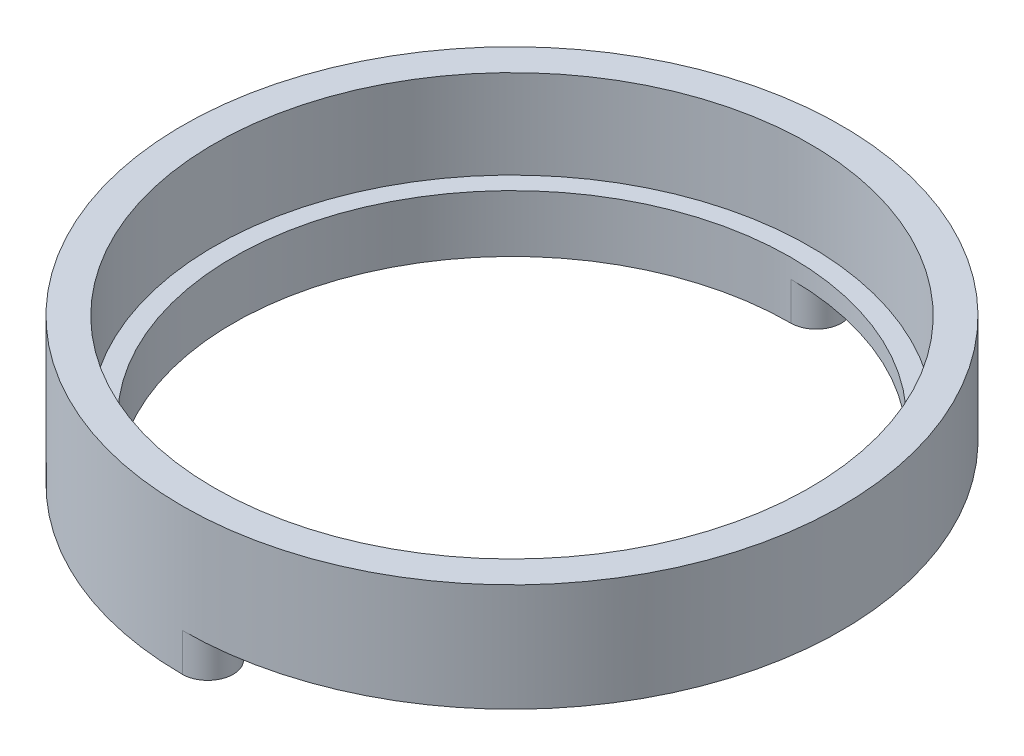
ISO-10303-21;
HEADER;
FILE_DESCRIPTION(('STEP AP214'),'2;1');
FILE_NAME('part.step','',(''),(''),'','','');
FILE_SCHEMA(('AUTOMOTIVE_DESIGN { 1 0 10303 214 1 1 1 1 }'));
ENDSEC;
DATA;
#1=APPLICATION_CONTEXT('core data for automotive mechanical design processes');
#2=APPLICATION_PROTOCOL_DEFINITION('international standard','automotive_design',2000,#1);
#3=PRODUCT_CONTEXT('',#1,'mechanical');
#4=PRODUCT('Part','Part','',(#3));
#5=PRODUCT_RELATED_PRODUCT_CATEGORY('part','',(#4));
#6=PRODUCT_DEFINITION_FORMATION('','',#4);
#7=PRODUCT_DEFINITION_CONTEXT('part definition',#1,'design');
#8=PRODUCT_DEFINITION('design','',#6,#7);
#9=PRODUCT_DEFINITION_SHAPE('','',#8);
#10=(LENGTH_UNIT() NAMED_UNIT(*) SI_UNIT(.MILLI.,.METRE.));
#11=(NAMED_UNIT(*) PLANE_ANGLE_UNIT() SI_UNIT($,.RADIAN.));
#12=(NAMED_UNIT(*) SI_UNIT($,.STERADIAN.) SOLID_ANGLE_UNIT());
#13=UNCERTAINTY_MEASURE_WITH_UNIT(LENGTH_MEASURE(1.E-05),#10,'distance_accuracy_value','');
#14=(GEOMETRIC_REPRESENTATION_CONTEXT(3) GLOBAL_UNCERTAINTY_ASSIGNED_CONTEXT((#13)) GLOBAL_UNIT_ASSIGNED_CONTEXT((#10,
#11,#12)) REPRESENTATION_CONTEXT('',''));
#15=CARTESIAN_POINT('',(0.,0.,0.));
#16=DIRECTION('',(0.,0.,1.));
#17=DIRECTION('',(1.,0.,0.));
#18=AXIS2_PLACEMENT_3D('',#15,#16,#17);
#19=CARTESIAN_POINT('',(0.,1.5,0.));
#20=DIRECTION('',(0.,1.,0.));
#21=DIRECTION('',(0.,0.,1.));
#22=AXIS2_PLACEMENT_3D('',#19,#20,#21);
#23=PLANE('',#22);
#24=CARTESIAN_POINT('',(0.,1.5,0.));
#25=DIRECTION('',(0.,1.,0.));
#26=DIRECTION('',(0.,0.,1.));
#27=AXIS2_PLACEMENT_3D('',#24,#25,#26);
#28=CIRCLE('',#27,23.5);
#29=CARTESIAN_POINT('',(0.,1.5,23.5));
#30=VERTEX_POINT('',#29);
#31=EDGE_CURVE('E104',#30,#30,#28,.F.);
#32=ORIENTED_EDGE('',*,*,#31,.F.);
#33=EDGE_LOOP('',(#32));
#34=FACE_BOUND('',#33,.T.);
#35=CARTESIAN_POINT('',(0.,1.5,0.));
#36=DIRECTION('',(0.,1.,0.));
#37=DIRECTION('',(0.,0.,1.));
#38=AXIS2_PLACEMENT_3D('',#35,#36,#37);
#39=CIRCLE('',#38,22.);
#40=CARTESIAN_POINT('',(0.,1.5,22.));
#41=VERTEX_POINT('',#40);
#42=EDGE_CURVE('E11',#41,#41,#39,.T.);
#43=ORIENTED_EDGE('',*,*,#42,.F.);
#44=EDGE_LOOP('',(#43));
#45=FACE_BOUND('',#44,.T.);
#46=ADVANCED_FACE('F32',(#34,#45),#23,.T.);
#47=CARTESIAN_POINT('',(0.,0.,0.));
#48=DIRECTION('',(0.,1.,0.));
#49=DIRECTION('',(0.,0.,1.));
#50=AXIS2_PLACEMENT_3D('',#47,#48,#49);
#51=PLANE('',#50);
#52=CARTESIAN_POINT('',(0.,0.,24.));
#53=DIRECTION('',(0.,-1.,0.));
#54=DIRECTION('',(0.,0.,-1.));
#55=AXIS2_PLACEMENT_3D('',#52,#53,#54);
#56=CIRCLE('',#55,2.);
#57=CARTESIAN_POINT('',(0.,0.,22.));
#58=VERTEX_POINT('',#57);
#59=CARTESIAN_POINT('',(0.,0.,26.));
#60=VERTEX_POINT('',#59);
#61=EDGE_CURVE('E92',#58,#60,#56,.T.);
#62=ORIENTED_EDGE('',*,*,#61,.F.);
#63=CARTESIAN_POINT('',(0.,0.,0.));
#64=DIRECTION('',(0.,1.,0.));
#65=DIRECTION('',(0.,0.,1.));
#66=AXIS2_PLACEMENT_3D('',#63,#64,#65);
#67=CIRCLE('',#66,22.);
#68=CARTESIAN_POINT('',(0.,0.,-22.));
#69=VERTEX_POINT('',#68);
#70=EDGE_CURVE('E36',#58,#69,#67,.T.);
#71=ORIENTED_EDGE('',*,*,#70,.T.);
#72=CARTESIAN_POINT('',(0.,0.,-24.));
#73=DIRECTION('',(0.,-1.,0.));
#74=DIRECTION('',(0.,0.,-1.));
#75=AXIS2_PLACEMENT_3D('',#72,#73,#74);
#76=CIRCLE('',#75,2.);
#77=CARTESIAN_POINT('',(0.,0.,-26.));
#78=VERTEX_POINT('',#77);
#79=EDGE_CURVE('E47',#78,#69,#76,.T.);
#80=ORIENTED_EDGE('',*,*,#79,.F.);
#81=CARTESIAN_POINT('',(0.,0.,0.));
#82=DIRECTION('',(0.,1.,0.));
#83=DIRECTION('',(0.,0.,1.));
#84=AXIS2_PLACEMENT_3D('',#81,#82,#83);
#85=CIRCLE('',#84,26.);
#86=EDGE_CURVE('E51',#60,#78,#85,.T.);
#87=ORIENTED_EDGE('',*,*,#86,.F.);
#88=EDGE_LOOP('',(#62,#71,#80,#87));
#89=FACE_BOUND('',#88,.T.);
#90=ADVANCED_FACE('F34',(#89),#51,.F.);
#91=CARTESIAN_POINT('',(0.,1.5,0.));
#92=DIRECTION('',(0.,-1.,0.));
#93=DIRECTION('',(0.,0.,-1.));
#94=AXIS2_PLACEMENT_3D('',#91,#92,#93);
#95=CYLINDRICAL_SURFACE('',#94,22.);
#96=ORIENTED_EDGE('',*,*,#42,.T.);
#97=EDGE_LOOP('',(#96));
#98=FACE_BOUND('',#97,.T.);
#99=ORIENTED_EDGE('',*,*,#70,.F.);
#100=DIRECTION('',(0.,1.,0.));
#101=VECTOR('',#100,1.);
#102=CARTESIAN_POINT('',(0.,-3.,22.));
#103=LINE('',#102,#101);
#104=CARTESIAN_POINT('',(0.,-3.,22.));
#105=VERTEX_POINT('',#104);
#106=EDGE_CURVE('E117',#105,#58,#103,.T.);
#107=ORIENTED_EDGE('',*,*,#106,.F.);
#108=CARTESIAN_POINT('',(0.,-3.,0.));
#109=DIRECTION('',(0.,1.,0.));
#110=DIRECTION('',(0.,0.,-1.));
#111=AXIS2_PLACEMENT_3D('',#108,#109,#110);
#112=CIRCLE('',#111,22.);
#113=CARTESIAN_POINT('',(0.,-3.,-22.));
#114=VERTEX_POINT('',#113);
#115=EDGE_CURVE('E86',#114,#105,#112,.T.);
#116=ORIENTED_EDGE('',*,*,#115,.F.);
#117=DIRECTION('',(0.,1.,0.));
#118=VECTOR('',#117,1.);
#119=CARTESIAN_POINT('',(0.,-3.,-22.));
#120=LINE('',#119,#118);
#121=EDGE_CURVE('E97',#114,#69,#120,.T.);
#122=ORIENTED_EDGE('',*,*,#121,.T.);
#123=EDGE_LOOP('',(#99,#107,#116,#122));
#124=FACE_BOUND('',#123,.T.);
#125=ADVANCED_FACE('F116',(#98,#124),#95,.F.);
#126=CARTESIAN_POINT('',(0.,8.5,0.));
#127=DIRECTION('',(0.,1.,0.));
#128=DIRECTION('',(0.,0.,1.));
#129=AXIS2_PLACEMENT_3D('',#126,#127,#128);
#130=PLANE('',#129);
#131=CARTESIAN_POINT('',(0.,8.5,0.));
#132=DIRECTION('',(0.,1.,0.));
#133=DIRECTION('',(0.,0.,1.));
#134=AXIS2_PLACEMENT_3D('',#131,#132,#133);
#135=CIRCLE('',#134,26.);
#136=CARTESIAN_POINT('',(0.,8.5,26.));
#137=VERTEX_POINT('',#136);
#138=EDGE_CURVE('E101',#137,#137,#135,.T.);
#139=ORIENTED_EDGE('',*,*,#138,.T.);
#140=EDGE_LOOP('',(#139));
#141=FACE_BOUND('',#140,.T.);
#142=CARTESIAN_POINT('',(0.,8.5,0.));
#143=DIRECTION('',(0.,1.,0.));
#144=DIRECTION('',(0.,0.,1.));
#145=AXIS2_PLACEMENT_3D('',#142,#143,#144);
#146=CIRCLE('',#145,23.5);
#147=CARTESIAN_POINT('',(0.,8.5,23.5));
#148=VERTEX_POINT('',#147);
#149=EDGE_CURVE('E93',#148,#148,#146,.T.);
#150=ORIENTED_EDGE('',*,*,#149,.F.);
#151=EDGE_LOOP('',(#150));
#152=FACE_BOUND('',#151,.T.);
#153=ADVANCED_FACE('F123',(#141,#152),#130,.T.);
#154=CARTESIAN_POINT('',(0.,8.5,0.));
#155=DIRECTION('',(0.,-1.,0.));
#156=DIRECTION('',(0.,0.,-1.));
#157=AXIS2_PLACEMENT_3D('',#154,#155,#156);
#158=CYLINDRICAL_SURFACE('',#157,26.);
#159=ORIENTED_EDGE('',*,*,#138,.F.);
#160=EDGE_LOOP('',(#159));
#161=FACE_BOUND('',#160,.T.);
#162=ORIENTED_EDGE('',*,*,#86,.T.);
#163=DIRECTION('',(0.,1.,0.));
#164=VECTOR('',#163,1.);
#165=CARTESIAN_POINT('',(0.,-3.,-26.));
#166=LINE('',#165,#164);
#167=CARTESIAN_POINT('',(0.,-3.,-26.));
#168=VERTEX_POINT('',#167);
#169=EDGE_CURVE('E77',#168,#78,#166,.T.);
#170=ORIENTED_EDGE('',*,*,#169,.F.);
#171=CARTESIAN_POINT('',(0.,-3.,0.));
#172=DIRECTION('',(0.,-1.,0.));
#173=DIRECTION('',(0.,0.,-1.));
#174=AXIS2_PLACEMENT_3D('',#171,#172,#173);
#175=CIRCLE('',#174,26.);
#176=CARTESIAN_POINT('',(0.,-3.,26.));
#177=VERTEX_POINT('',#176);
#178=EDGE_CURVE('E70',#177,#168,#175,.T.);
#179=ORIENTED_EDGE('',*,*,#178,.F.);
#180=DIRECTION('',(0.,1.,0.));
#181=VECTOR('',#180,1.);
#182=CARTESIAN_POINT('',(0.,-3.,26.));
#183=LINE('',#182,#181);
#184=EDGE_CURVE('E74',#177,#60,#183,.T.);
#185=ORIENTED_EDGE('',*,*,#184,.T.);
#186=EDGE_LOOP('',(#162,#170,#179,#185));
#187=FACE_BOUND('',#186,.T.);
#188=ADVANCED_FACE('F72',(#161,#187),#158,.T.);
#189=CARTESIAN_POINT('',(0.,8.5,0.));
#190=DIRECTION('',(0.,-1.,0.));
#191=DIRECTION('',(0.,0.,-1.));
#192=AXIS2_PLACEMENT_3D('',#189,#190,#191);
#193=CYLINDRICAL_SURFACE('',#192,23.5);
#194=ORIENTED_EDGE('',*,*,#31,.T.);
#195=EDGE_LOOP('',(#194));
#196=FACE_BOUND('',#195,.T.);
#197=ORIENTED_EDGE('',*,*,#149,.T.);
#198=EDGE_LOOP('',(#197));
#199=FACE_BOUND('',#198,.T.);
#200=ADVANCED_FACE('F152',(#196,#199),#193,.F.);
#201=CARTESIAN_POINT('',(0.,-3.,24.));
#202=DIRECTION('',(0.,1.,0.));
#203=DIRECTION('',(0.,0.,1.));
#204=AXIS2_PLACEMENT_3D('',#201,#202,#203);
#205=CYLINDRICAL_SURFACE('',#204,2.);
#206=ORIENTED_EDGE('',*,*,#61,.T.);
#207=ORIENTED_EDGE('',*,*,#184,.F.);
#208=CARTESIAN_POINT('',(0.,-3.,24.));
#209=DIRECTION('',(0.,-1.,0.));
#210=DIRECTION('',(0.,0.,-1.));
#211=AXIS2_PLACEMENT_3D('',#208,#209,#210);
#212=CIRCLE('',#211,2.);
#213=EDGE_CURVE('E81',#105,#177,#212,.T.);
#214=ORIENTED_EDGE('',*,*,#213,.F.);
#215=ORIENTED_EDGE('',*,*,#106,.T.);
#216=EDGE_LOOP('',(#206,#207,#214,#215));
#217=FACE_BOUND('',#216,.T.);
#218=ADVANCED_FACE('F91',(#217),#205,.T.);
#219=CARTESIAN_POINT('',(0.,-3.,-24.));
#220=DIRECTION('',(0.,1.,0.));
#221=DIRECTION('',(0.,0.,1.));
#222=AXIS2_PLACEMENT_3D('',#219,#220,#221);
#223=CYLINDRICAL_SURFACE('',#222,2.);
#224=ORIENTED_EDGE('',*,*,#79,.T.);
#225=ORIENTED_EDGE('',*,*,#121,.F.);
#226=CARTESIAN_POINT('',(0.,-3.,-24.));
#227=DIRECTION('',(0.,-1.,0.));
#228=DIRECTION('',(0.,0.,-1.));
#229=AXIS2_PLACEMENT_3D('',#226,#227,#228);
#230=CIRCLE('',#229,2.);
#231=EDGE_CURVE('E80',#168,#114,#230,.T.);
#232=ORIENTED_EDGE('',*,*,#231,.F.);
#233=ORIENTED_EDGE('',*,*,#169,.T.);
#234=EDGE_LOOP('',(#224,#225,#232,#233));
#235=FACE_BOUND('',#234,.T.);
#236=ADVANCED_FACE('F114',(#235),#223,.T.);
#237=CARTESIAN_POINT('',(0.,-3.,12.));
#238=DIRECTION('',(0.,-1.,0.));
#239=DIRECTION('',(0.,0.,-1.));
#240=AXIS2_PLACEMENT_3D('',#237,#238,#239);
#241=PLANE('',#240);
#242=ORIENTED_EDGE('',*,*,#213,.T.);
#243=ORIENTED_EDGE('',*,*,#178,.T.);
#244=ORIENTED_EDGE('',*,*,#231,.T.);
#245=ORIENTED_EDGE('',*,*,#115,.T.);
#246=EDGE_LOOP('',(#242,#243,#244,#245));
#247=FACE_BOUND('',#246,.T.);
#248=ADVANCED_FACE('F84',(#247),#241,.T.);
#249=CLOSED_SHELL('',(#46,#90,#125,#153,#188,#200,#218,#236,#248));
#250=MANIFOLD_SOLID_BREP('B2',#249);
#251=ADVANCED_BREP_SHAPE_REPRESENTATION('',(#18,#250),#14);
#252=SHAPE_DEFINITION_REPRESENTATION(#9,#251);
ENDSEC;
END-ISO-10303-21;
